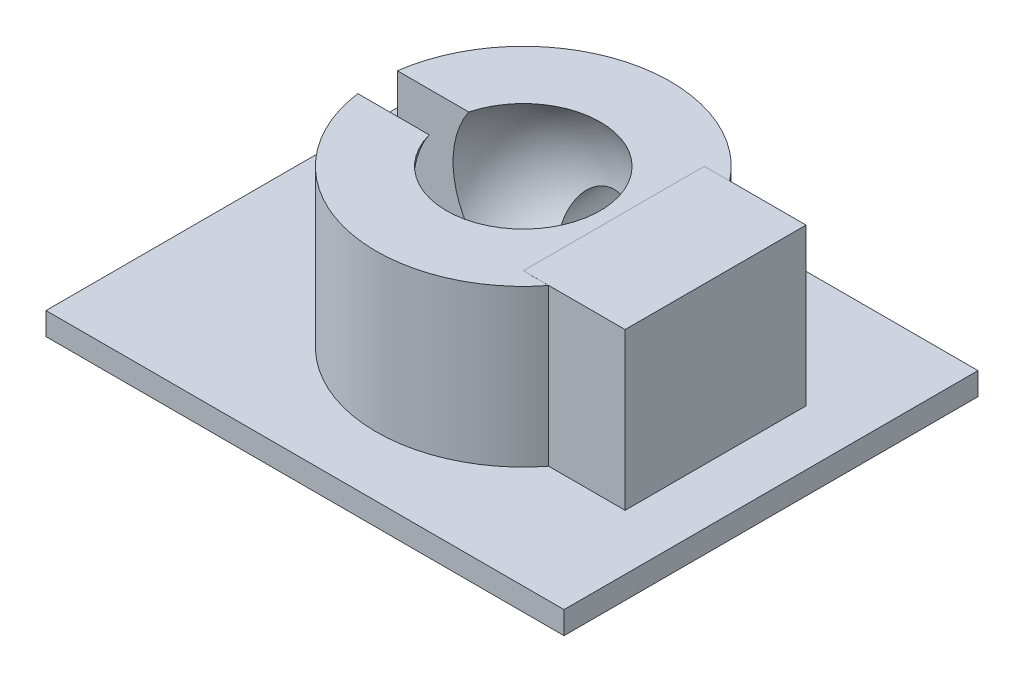
ISO-10303-21;
HEADER;
FILE_DESCRIPTION(('STEP AP214'),'2;1');
FILE_NAME('part.step','',(''),(''),'','','');
FILE_SCHEMA(('AUTOMOTIVE_DESIGN { 1 0 10303 214 1 1 1 1 }'));
ENDSEC;
DATA;
#1=APPLICATION_CONTEXT('core data for automotive mechanical design processes');
#2=APPLICATION_PROTOCOL_DEFINITION('international standard','automotive_design',2000,#1);
#3=PRODUCT_CONTEXT('',#1,'mechanical');
#4=PRODUCT('Part','Part','',(#3));
#5=PRODUCT_RELATED_PRODUCT_CATEGORY('part','',(#4));
#6=PRODUCT_DEFINITION_FORMATION('','',#4);
#7=PRODUCT_DEFINITION_CONTEXT('part definition',#1,'design');
#8=PRODUCT_DEFINITION('design','',#6,#7);
#9=PRODUCT_DEFINITION_SHAPE('','',#8);
#10=(LENGTH_UNIT() NAMED_UNIT(*) SI_UNIT(.MILLI.,.METRE.));
#11=(NAMED_UNIT(*) PLANE_ANGLE_UNIT() SI_UNIT($,.RADIAN.));
#12=(NAMED_UNIT(*) SI_UNIT($,.STERADIAN.) SOLID_ANGLE_UNIT());
#13=UNCERTAINTY_MEASURE_WITH_UNIT(LENGTH_MEASURE(1.E-05),#10,'distance_accuracy_value','');
#14=(GEOMETRIC_REPRESENTATION_CONTEXT(3) GLOBAL_UNCERTAINTY_ASSIGNED_CONTEXT((#13)) GLOBAL_UNIT_ASSIGNED_CONTEXT((#10,
#11,#12)) REPRESENTATION_CONTEXT('',''));
#15=CARTESIAN_POINT('',(0.,0.,0.));
#16=DIRECTION('',(0.,0.,1.));
#17=DIRECTION('',(1.,0.,0.));
#18=AXIS2_PLACEMENT_3D('',#15,#16,#17);
#19=CARTESIAN_POINT('',(0.,15.84,0.));
#20=DIRECTION('',(0.,-1.,0.));
#21=DIRECTION('',(0.,0.,-1.));
#22=AXIS2_PLACEMENT_3D('',#19,#20,#21);
#23=CYLINDRICAL_SURFACE('',#22,13.);
#24=CARTESIAN_POINT('',(2.85,7.2,-12.6837494456489));
#25=CARTESIAN_POINT('',(2.84999457814601,7.04199211718748,-12.683752639175));
#26=CARTESIAN_POINT('',(2.83681505009,6.88391914794053,-12.6867341814607));
#27=CARTESIAN_POINT('',(2.78450326327586,6.57226918502549,-12.6983161510032));
#28=CARTESIAN_POINT('',(2.74535229710446,6.41869551555586,-12.7069206284339));
#29=CARTESIAN_POINT('',(2.64239018842769,6.12059737544053,-12.7287281927453));
#30=CARTESIAN_POINT('',(2.57860617578493,5.97606315188572,-12.741926218899));
#31=CARTESIAN_POINT('',(2.42826627805288,5.6997437142269,-12.7714277008736));
#32=CARTESIAN_POINT('',(2.34171083999033,5.56795824992097,-12.787731095731));
#33=CARTESIAN_POINT('',(2.14671933312393,5.31863880501277,-12.8219154465526));
#34=CARTESIAN_POINT('',(2.03796985040492,5.20135267861249,-12.8398166611201));
#35=CARTESIAN_POINT('',(1.80235380097448,4.98653214572527,-12.875002301063));
#36=CARTESIAN_POINT('',(1.67548582327419,4.88899927896728,-12.8922866782708));
#37=CARTESIAN_POINT('',(1.40557181065307,4.71547295236465,-12.9245118312371));
#38=CARTESIAN_POINT('',(1.26236900777135,4.63971795634621,-12.939425916034));
#39=CARTESIAN_POINT('',(0.964883943547343,4.51344068026091,-12.9650012018085));
#40=CARTESIAN_POINT('',(0.810602933542202,4.46291555547005,-12.9756628822269));
#41=CARTESIAN_POINT('',(0.497918114659505,4.38931199385956,-12.991388916655));
#42=CARTESIAN_POINT('',(0.339617423197319,4.36581405843454,-12.9965387322379));
#43=CARTESIAN_POINT('',(0.0212426812353905,4.34562021843313,-13.0009569161528));
#44=CARTESIAN_POINT('',(-0.138831163380759,4.34892123409904,-13.0002259603081));
#45=CARTESIAN_POINT('',(-0.453316132225556,4.38191932163188,-12.9930302485539));
#46=CARTESIAN_POINT('',(-0.607777280632989,4.41116421641512,-12.9866637194479));
#47=CARTESIAN_POINT('',(-0.909544735417951,4.49449925403317,-12.9690241717223));
#48=CARTESIAN_POINT('',(-1.05685071697575,4.54859052364369,-12.9577509305859));
#49=CARTESIAN_POINT('',(-1.3413806317717,4.68048231020951,-12.9314067961729));
#50=CARTESIAN_POINT('',(-1.47852255749359,4.75845406811767,-12.9163086149913));
#51=CARTESIAN_POINT('',(-1.73794026407782,4.93576577133281,-12.8839698123818));
#52=CARTESIAN_POINT('',(-1.86021400743718,5.03510864013599,-12.8667288979714));
#53=CARTESIAN_POINT('',(-2.08911385803712,5.25480376479951,-12.831574861524));
#54=CARTESIAN_POINT('',(-2.19535947469234,5.37555175910412,-12.8136552214554));
#55=CARTESIAN_POINT('',(-2.38616440780198,5.63333648895701,-12.7795008740164));
#56=CARTESIAN_POINT('',(-2.47072313092283,5.77037367001248,-12.7632662127526));
#57=CARTESIAN_POINT('',(-2.61592418938986,6.05746396395508,-12.7343026762405));
#58=CARTESIAN_POINT('',(-2.67649431629764,6.20755474062339,-12.7215844199456));
#59=CARTESIAN_POINT('',(-2.77143785655332,6.51612934551443,-12.7012406610616));
#60=CARTESIAN_POINT('',(-2.80581544671902,6.67461183123261,-12.6936143465052));
#61=CARTESIAN_POINT('',(-2.84680724633995,6.99199362570388,-12.6844836257708));
#62=CARTESIAN_POINT('',(-2.85397561097445,7.15081793075217,-12.6828570459931));
#63=CARTESIAN_POINT('',(-2.84184604413616,7.46739222853821,-12.6855803470866));
#64=CARTESIAN_POINT('',(-2.82254993988463,7.62514229469034,-12.6899298153456));
#65=CARTESIAN_POINT('',(-2.75852005661616,7.93315865363888,-12.7039997410091));
#66=CARTESIAN_POINT('',(-2.7140917645201,8.08349167098519,-12.7136556579756));
#67=CARTESIAN_POINT('',(-2.60138955360095,8.37457984329172,-12.7371922332786));
#68=CARTESIAN_POINT('',(-2.53311334368186,8.51533407645454,-12.7510732975132));
#69=CARTESIAN_POINT('',(-2.37343343419326,8.78566653369884,-12.7817643730783));
#70=CARTESIAN_POINT('',(-2.28168851880467,8.91503834687656,-12.798616346249));
#71=CARTESIAN_POINT('',(-2.07812174800801,9.15675337363935,-12.8332398963129));
#72=CARTESIAN_POINT('',(-1.96629738727772,9.26909445906268,-12.8510115877626));
#73=CARTESIAN_POINT('',(-1.72323782951113,9.47571145768575,-12.8858750533308));
#74=CARTESIAN_POINT('',(-1.59167821427601,9.5696094785427,-12.9029478507508));
#75=CARTESIAN_POINT('',(-1.31433100395662,9.73397190897161,-12.9341400353273));
#76=CARTESIAN_POINT('',(-1.16854407537848,9.80443741560427,-12.9482595607384));
#77=CARTESIAN_POINT('',(-0.867790948180158,9.91940901401435,-12.9718743296362));
#78=CARTESIAN_POINT('',(-0.712890181138144,9.96407997520845,-12.9813988766561));
#79=CARTESIAN_POINT('',(-0.397550404994966,10.0267090305703,-12.994877255881));
#80=CARTESIAN_POINT('',(-0.237112208417187,10.0446710269161,-12.9988319018438));
#81=CARTESIAN_POINT('',(0.0811613433687345,10.0531961539511,-13.000700597871));
#82=CARTESIAN_POINT('',(0.238981122228655,10.0443233905905,-12.9987390180743));
#83=CARTESIAN_POINT('',(0.550821825446172,10.0006931110576,-12.9892622768432));
#84=CARTESIAN_POINT('',(0.704842818651223,9.96593606435678,-12.9817472161341));
#85=CARTESIAN_POINT('',(1.00427520561563,9.87179469459657,-12.9620172693561));
#86=CARTESIAN_POINT('',(1.1497129352056,9.81249071681113,-12.9498177255386));
#87=CARTESIAN_POINT('',(1.4286485814395,9.67101711644236,-12.9220212485419));
#88=CARTESIAN_POINT('',(1.56214533166847,9.58884526330262,-12.9064239839776));
#89=CARTESIAN_POINT('',(1.81615997073245,9.40213090011084,-12.8731621246939));
#90=CARTESIAN_POINT('',(1.93638203275955,9.29719190757184,-12.8554637967618));
#91=CARTESIAN_POINT('',(2.15770295120599,9.06872137256736,-12.8201757894123));
#92=CARTESIAN_POINT('',(2.25879718824908,8.94518535181458,-12.8025861372298));
#93=CARTESIAN_POINT('',(2.44030274899356,8.68102983280113,-12.7692433230865));
#94=CARTESIAN_POINT('',(2.52041768495175,8.54020296010177,-12.7535180354791));
#95=CARTESIAN_POINT('',(2.65571630709806,8.24676938102076,-12.7260352735789));
#96=CARTESIAN_POINT('',(2.71092104940724,8.09417275165109,-12.7142744503338));
#97=CARTESIAN_POINT('',(2.78500100109206,7.81785560525803,-12.6982215600804));
#98=CARTESIAN_POINT('',(2.8093287860261,7.69563150626974,-12.6928306080988));
#99=CARTESIAN_POINT('',(2.84183002421795,7.44895166676108,-12.6855933799393));
#100=CARTESIAN_POINT('',(2.85000427193453,7.32449603629506,-12.6837469294369));
#101=CARTESIAN_POINT('',(2.85,7.2,-12.6837494456489));
#102=B_SPLINE_CURVE_WITH_KNOTS('',3,(#24,#25,#26,#27,#28,#29,#30,#31,#32,#33,#34,#35,#36,#37,
#38,#39,#40,#41,#42,#43,#44,#45,#46,#47,#48,#49,#50,#51,#52,#53,#54,#55,#56,#57,#58,#59,#60,#61,
#62,#63,#64,#65,#66,#67,#68,#69,#70,#71,#72,#73,#74,#75,#76,#77,#78,#79,#80,#81,#82,#83,#84,#85,
#86,#87,#88,#89,#90,#91,#92,#93,#94,#95,#96,#97,#98,#99,#100,#101),.UNSPECIFIED.,.T.,.F.,(4,2,2,
2,2,2,2,2,2,2,2,2,2,2,2,2,2,2,2,2,2,2,2,2,2,2,2,2,2,2,2,2,2,2,2,2,2,2,4),(0.,0.47356736558192,
0.947476216068068,1.42086460378329,1.89424369908617,2.37483847588496,2.85547069972483,
3.34118107690835,3.82683667679583,4.30484795958542,4.78280430969933,5.2525905041419,
5.72239800535252,6.1956565440954,6.66897986423184,7.15219665860458,7.63542667193723,
8.12010040478494,8.60469683248835,9.07936909035866,9.55400857645529,10.0229990082994,
10.4920345089746,10.9683209332694,11.4446668253998,11.9299372630078,12.4151849780821,
12.897295818679,13.379336215989,13.8513143483056,14.3232839204113,14.7937207402394,
15.2642034630583,15.7436523504286,16.2232168774919,16.7092297924385,17.1948311166262,
17.567978068022,17.9411066669515),.UNSPECIFIED.);
#103=CARTESIAN_POINT('',(2.85,7.2,-12.6837494456489));
#104=VERTEX_POINT('',#103);
#105=EDGE_CURVE('E194',#104,#104,#102,.T.);
#106=ORIENTED_EDGE('',*,*,#105,.F.);
#107=EDGE_LOOP('',(#106));
#108=FACE_BOUND('',#107,.T.);
#109=DIRECTION('',(0.,-1.,0.));
#110=VECTOR('',#109,1.);
#111=CARTESIAN_POINT('',(-12.8816730279883,15.84,-1.75));
#112=LINE('',#111,#110);
#113=CARTESIAN_POINT('',(-12.8816730279883,15.84,-1.75));
#114=VERTEX_POINT('',#113);
#115=CARTESIAN_POINT('',(-12.8816730279883,2.,-1.75));
#116=VERTEX_POINT('',#115);
#117=EDGE_CURVE('E154',#114,#116,#112,.T.);
#118=ORIENTED_EDGE('',*,*,#117,.F.);
#119=CARTESIAN_POINT('',(0.,15.84,0.));
#120=DIRECTION('',(0.,1.,0.));
#121=DIRECTION('',(0.,0.,1.));
#122=AXIS2_PLACEMENT_3D('',#119,#120,#121);
#123=CIRCLE('',#122,13.);
#124=CARTESIAN_POINT('',(10.2469507659596,15.84,-8.));
#125=VERTEX_POINT('',#124);
#126=EDGE_CURVE('E240',#125,#114,#123,.T.);
#127=ORIENTED_EDGE('',*,*,#126,.F.);
#128=DIRECTION('',(0.,-1.,0.));
#129=VECTOR('',#128,1.);
#130=CARTESIAN_POINT('',(10.2469507659596,15.84,-8.));
#131=LINE('',#130,#129);
#132=CARTESIAN_POINT('',(10.2469507659596,2.,-8.));
#133=VERTEX_POINT('',#132);
#134=EDGE_CURVE('E241',#133,#125,#131,.F.);
#135=ORIENTED_EDGE('',*,*,#134,.F.);
#136=CARTESIAN_POINT('',(0.,2.,0.));
#137=DIRECTION('',(0.,1.,0.));
#138=DIRECTION('',(0.,0.,1.));
#139=AXIS2_PLACEMENT_3D('',#136,#137,#138);
#140=CIRCLE('',#139,13.);
#141=EDGE_CURVE('E248',#133,#116,#140,.T.);
#142=ORIENTED_EDGE('',*,*,#141,.T.);
#143=EDGE_LOOP('',(#118,#127,#135,#142));
#144=FACE_BOUND('',#143,.T.);
#145=ADVANCED_FACE('F43',(#108,#144),#23,.T.);
#146=CARTESIAN_POINT('',(0.,2.,0.));
#147=DIRECTION('',(0.,1.,0.));
#148=DIRECTION('',(0.,0.,1.));
#149=AXIS2_PLACEMENT_3D('',#146,#147,#148);
#150=PLANE('',#149);
#151=CARTESIAN_POINT('',(-12.8816730279883,2.,1.75));
#152=VERTEX_POINT('',#151);
#153=CARTESIAN_POINT('',(10.2469507659596,2.,8.));
#154=VERTEX_POINT('',#153);
#155=EDGE_CURVE('E251',#152,#154,#140,.T.);
#156=ORIENTED_EDGE('',*,*,#155,.F.);
#157=DIRECTION('',(1.,0.,0.));
#158=VECTOR('',#157,1.);
#159=CARTESIAN_POINT('',(-13.,2.,1.75));
#160=LINE('',#159,#158);
#161=CARTESIAN_POINT('',(-5.5,2.,1.75));
#162=VERTEX_POINT('',#161);
#163=EDGE_CURVE('E164',#152,#162,#160,.T.);
#164=ORIENTED_EDGE('',*,*,#163,.T.);
#165=DIRECTION('',(0.,0.,-1.));
#166=VECTOR('',#165,1.);
#167=CARTESIAN_POINT('',(-5.5,2.,1.75));
#168=LINE('',#167,#166);
#169=CARTESIAN_POINT('',(-5.5,2.,-1.75));
#170=VERTEX_POINT('',#169);
#171=EDGE_CURVE('E160',#162,#170,#168,.T.);
#172=ORIENTED_EDGE('',*,*,#171,.T.);
#173=DIRECTION('',(1.,0.,0.));
#174=VECTOR('',#173,1.);
#175=CARTESIAN_POINT('',(-13.,2.,-1.75));
#176=LINE('',#175,#174);
#177=EDGE_CURVE('E150',#116,#170,#176,.T.);
#178=ORIENTED_EDGE('',*,*,#177,.F.);
#179=ORIENTED_EDGE('',*,*,#141,.F.);
#180=DIRECTION('',(-1.,0.,0.));
#181=VECTOR('',#180,1.);
#182=CARTESIAN_POINT('',(8.,2.,-8.));
#183=LINE('',#182,#181);
#184=CARTESIAN_POINT('',(17.,2.,-8.));
#185=VERTEX_POINT('',#184);
#186=EDGE_CURVE('E336',#185,#133,#183,.T.);
#187=ORIENTED_EDGE('',*,*,#186,.F.);
#188=DIRECTION('',(0.,0.,-1.));
#189=VECTOR('',#188,1.);
#190=CARTESIAN_POINT('',(17.,2.,-8.));
#191=LINE('',#190,#189);
#192=CARTESIAN_POINT('',(17.,2.,8.));
#193=VERTEX_POINT('',#192);
#194=EDGE_CURVE('E292',#193,#185,#191,.T.);
#195=ORIENTED_EDGE('',*,*,#194,.F.);
#196=DIRECTION('',(1.,0.,0.));
#197=VECTOR('',#196,1.);
#198=CARTESIAN_POINT('',(8.,2.,8.));
#199=LINE('',#198,#197);
#200=EDGE_CURVE('E339',#154,#193,#199,.T.);
#201=ORIENTED_EDGE('',*,*,#200,.F.);
#202=EDGE_LOOP('',(#156,#164,#172,#178,#179,#187,#195,#201));
#203=FACE_BOUND('',#202,.T.);
#204=DIRECTION('',(0.,0.,1.));
#205=VECTOR('',#204,1.);
#206=CARTESIAN_POINT('',(-23.9,2.,-18.3));
#207=LINE('',#206,#205);
#208=CARTESIAN_POINT('',(-23.9,2.,-18.3));
#209=VERTEX_POINT('',#208);
#210=CARTESIAN_POINT('',(-23.9,2.,18.3));
#211=VERTEX_POINT('',#210);
#212=EDGE_CURVE('E252',#209,#211,#207,.T.);
#213=ORIENTED_EDGE('',*,*,#212,.T.);
#214=DIRECTION('',(1.,0.,0.));
#215=VECTOR('',#214,1.);
#216=CARTESIAN_POINT('',(-23.9,2.,18.3));
#217=LINE('',#216,#215);
#218=CARTESIAN_POINT('',(21.9,2.,18.3));
#219=VERTEX_POINT('',#218);
#220=EDGE_CURVE('E255',#211,#219,#217,.T.);
#221=ORIENTED_EDGE('',*,*,#220,.T.);
#222=DIRECTION('',(0.,0.,-1.));
#223=VECTOR('',#222,1.);
#224=CARTESIAN_POINT('',(21.9,2.,-18.3));
#225=LINE('',#224,#223);
#226=CARTESIAN_POINT('',(21.9,2.,-18.3));
#227=VERTEX_POINT('',#226);
#228=EDGE_CURVE('E258',#219,#227,#225,.T.);
#229=ORIENTED_EDGE('',*,*,#228,.T.);
#230=DIRECTION('',(-1.,0.,0.));
#231=VECTOR('',#230,1.);
#232=CARTESIAN_POINT('',(-23.9,2.,-18.3));
#233=LINE('',#232,#231);
#234=EDGE_CURVE('E260',#227,#209,#233,.T.);
#235=ORIENTED_EDGE('',*,*,#234,.T.);
#236=EDGE_LOOP('',(#213,#221,#229,#235));
#237=FACE_BOUND('',#236,.T.);
#238=ADVANCED_FACE('F162',(#203,#237),#150,.T.);
#239=CARTESIAN_POINT('',(-12.8816730279883,15.84,1.75));
#240=VERTEX_POINT('',#239);
#241=CARTESIAN_POINT('',(10.2469507659596,15.84,8.));
#242=VERTEX_POINT('',#241);
#243=EDGE_CURVE('E236',#240,#242,#123,.T.);
#244=ORIENTED_EDGE('',*,*,#243,.F.);
#245=DIRECTION('',(0.,-1.,0.));
#246=VECTOR('',#245,1.);
#247=CARTESIAN_POINT('',(-12.8816730279883,15.84,1.75));
#248=LINE('',#247,#246);
#249=EDGE_CURVE('E183',#240,#152,#248,.T.);
#250=ORIENTED_EDGE('',*,*,#249,.T.);
#251=ORIENTED_EDGE('',*,*,#155,.T.);
#252=DIRECTION('',(0.,-1.,0.));
#253=VECTOR('',#252,1.);
#254=CARTESIAN_POINT('',(10.2469507659596,15.84,8.));
#255=LINE('',#254,#253);
#256=EDGE_CURVE('E238',#242,#154,#255,.T.);
#257=ORIENTED_EDGE('',*,*,#256,.F.);
#258=EDGE_LOOP('',(#244,#250,#251,#257));
#259=FACE_BOUND('',#258,.T.);
#260=ADVANCED_FACE('F218',(#259),#23,.T.);
#261=CARTESIAN_POINT('',(0.,15.84,0.));
#262=DIRECTION('',(0.,1.,0.));
#263=DIRECTION('',(0.,0.,1.));
#264=AXIS2_PLACEMENT_3D('',#261,#262,#263);
#265=PLANE('',#264);
#266=DIRECTION('',(-1.,0.,0.));
#267=VECTOR('',#266,1.);
#268=CARTESIAN_POINT('',(-13.,15.84,1.75));
#269=LINE('',#268,#267);
#270=CARTESIAN_POINT('',(-6.57266308279985,15.84,1.75));
#271=VERTEX_POINT('',#270);
#272=EDGE_CURVE('E168',#271,#240,#269,.T.);
#273=ORIENTED_EDGE('',*,*,#272,.T.);
#274=ORIENTED_EDGE('',*,*,#243,.T.);
#275=DIRECTION('',(-1.,0.,0.));
#276=VECTOR('',#275,1.);
#277=CARTESIAN_POINT('',(0.,15.84,8.));
#278=LINE('',#277,#276);
#279=CARTESIAN_POINT('',(8.,15.84,8.));
#280=VERTEX_POINT('',#279);
#281=EDGE_CURVE('E250',#242,#280,#278,.T.);
#282=ORIENTED_EDGE('',*,*,#281,.T.);
#283=DIRECTION('',(0.,0.,-1.));
#284=VECTOR('',#283,1.);
#285=CARTESIAN_POINT('',(8.,15.84,0.));
#286=LINE('',#285,#284);
#287=CARTESIAN_POINT('',(8.,15.84,-8.));
#288=VERTEX_POINT('',#287);
#289=EDGE_CURVE('E282',#280,#288,#286,.T.);
#290=ORIENTED_EDGE('',*,*,#289,.T.);
#291=DIRECTION('',(1.,0.,0.));
#292=VECTOR('',#291,1.);
#293=CARTESIAN_POINT('',(0.,15.84,-8.));
#294=LINE('',#293,#292);
#295=EDGE_CURVE('E285',#288,#125,#294,.T.);
#296=ORIENTED_EDGE('',*,*,#295,.T.);
#297=ORIENTED_EDGE('',*,*,#126,.T.);
#298=DIRECTION('',(-1.,0.,0.));
#299=VECTOR('',#298,1.);
#300=CARTESIAN_POINT('',(-13.,15.84,-1.75));
#301=LINE('',#300,#299);
#302=CARTESIAN_POINT('',(-6.57266308279985,15.84,-1.75));
#303=VERTEX_POINT('',#302);
#304=EDGE_CURVE('E173',#303,#114,#301,.T.);
#305=ORIENTED_EDGE('',*,*,#304,.F.);
#306=CARTESIAN_POINT('',(0.,15.84,0.));
#307=DIRECTION('',(0.,1.,0.));
#308=DIRECTION('',(0.,0.,1.));
#309=AXIS2_PLACEMENT_3D('',#306,#307,#308);
#310=CIRCLE('',#309,6.80164685940104);
#311=EDGE_CURVE('E289',#271,#303,#310,.T.);
#312=ORIENTED_EDGE('',*,*,#311,.F.);
#313=EDGE_LOOP('',(#273,#274,#282,#290,#296,#297,#305,#312));
#314=FACE_BOUND('',#313,.T.);
#315=ADVANCED_FACE('F228',(#314),#265,.T.);
#316=CARTESIAN_POINT('',(-23.9,2.,-18.3));
#317=DIRECTION('',(1.,0.,0.));
#318=DIRECTION('',(0.,0.,-1.));
#319=AXIS2_PLACEMENT_3D('',#316,#317,#318);
#320=PLANE('',#319);
#321=DIRECTION('',(0.,0.,1.));
#322=VECTOR('',#321,1.);
#323=CARTESIAN_POINT('',(-23.9,0.,-18.3));
#324=LINE('',#323,#322);
#325=CARTESIAN_POINT('',(-23.9,0.,-18.3));
#326=VERTEX_POINT('',#325);
#327=CARTESIAN_POINT('',(-23.9,0.,18.3));
#328=VERTEX_POINT('',#327);
#329=EDGE_CURVE('E244',#326,#328,#324,.T.);
#330=ORIENTED_EDGE('',*,*,#329,.T.);
#331=DIRECTION('',(0.,-1.,0.));
#332=VECTOR('',#331,1.);
#333=CARTESIAN_POINT('',(-23.9,2.,18.3));
#334=LINE('',#333,#332);
#335=EDGE_CURVE('E278',#211,#328,#334,.T.);
#336=ORIENTED_EDGE('',*,*,#335,.F.);
#337=ORIENTED_EDGE('',*,*,#212,.F.);
#338=DIRECTION('',(0.,-1.,0.));
#339=VECTOR('',#338,1.);
#340=CARTESIAN_POINT('',(-23.9,2.,-18.3));
#341=LINE('',#340,#339);
#342=EDGE_CURVE('E262',#209,#326,#341,.T.);
#343=ORIENTED_EDGE('',*,*,#342,.T.);
#344=EDGE_LOOP('',(#330,#336,#337,#343));
#345=FACE_BOUND('',#344,.T.);
#346=ADVANCED_FACE('F45',(#345),#320,.F.);
#347=CARTESIAN_POINT('',(-23.9,2.,18.3));
#348=DIRECTION('',(0.,0.,-1.));
#349=DIRECTION('',(-1.,0.,0.));
#350=AXIS2_PLACEMENT_3D('',#347,#348,#349);
#351=PLANE('',#350);
#352=DIRECTION('',(1.,0.,0.));
#353=VECTOR('',#352,1.);
#354=CARTESIAN_POINT('',(-23.9,0.,18.3));
#355=LINE('',#354,#353);
#356=CARTESIAN_POINT('',(21.9,0.,18.3));
#357=VERTEX_POINT('',#356);
#358=EDGE_CURVE('E265',#328,#357,#355,.T.);
#359=ORIENTED_EDGE('',*,*,#358,.T.);
#360=DIRECTION('',(0.,-1.,0.));
#361=VECTOR('',#360,1.);
#362=CARTESIAN_POINT('',(21.9,2.,18.3));
#363=LINE('',#362,#361);
#364=EDGE_CURVE('E275',#219,#357,#363,.T.);
#365=ORIENTED_EDGE('',*,*,#364,.F.);
#366=ORIENTED_EDGE('',*,*,#220,.F.);
#367=ORIENTED_EDGE('',*,*,#335,.T.);
#368=EDGE_LOOP('',(#359,#365,#366,#367));
#369=FACE_BOUND('',#368,.T.);
#370=ADVANCED_FACE('F451',(#369),#351,.F.);
#371=CARTESIAN_POINT('',(21.9,2.,-18.3));
#372=DIRECTION('',(-1.,0.,0.));
#373=DIRECTION('',(0.,0.,1.));
#374=AXIS2_PLACEMENT_3D('',#371,#372,#373);
#375=PLANE('',#374);
#376=DIRECTION('',(0.,0.,-1.));
#377=VECTOR('',#376,1.);
#378=CARTESIAN_POINT('',(21.9,0.,-18.3));
#379=LINE('',#378,#377);
#380=CARTESIAN_POINT('',(21.9,0.,-18.3));
#381=VERTEX_POINT('',#380);
#382=EDGE_CURVE('E267',#357,#381,#379,.T.);
#383=ORIENTED_EDGE('',*,*,#382,.T.);
#384=DIRECTION('',(0.,-1.,0.));
#385=VECTOR('',#384,1.);
#386=CARTESIAN_POINT('',(21.9,2.,-18.3));
#387=LINE('',#386,#385);
#388=EDGE_CURVE('E272',#227,#381,#387,.T.);
#389=ORIENTED_EDGE('',*,*,#388,.F.);
#390=ORIENTED_EDGE('',*,*,#228,.F.);
#391=ORIENTED_EDGE('',*,*,#364,.T.);
#392=EDGE_LOOP('',(#383,#389,#390,#391));
#393=FACE_BOUND('',#392,.T.);
#394=ADVANCED_FACE('F442',(#393),#375,.F.);
#395=CARTESIAN_POINT('',(-23.9,2.,-18.3));
#396=DIRECTION('',(0.,0.,1.));
#397=DIRECTION('',(1.,0.,0.));
#398=AXIS2_PLACEMENT_3D('',#395,#396,#397);
#399=PLANE('',#398);
#400=DIRECTION('',(-1.,0.,0.));
#401=VECTOR('',#400,1.);
#402=CARTESIAN_POINT('',(-23.9,0.,-18.3));
#403=LINE('',#402,#401);
#404=EDGE_CURVE('E256',#381,#326,#403,.T.);
#405=ORIENTED_EDGE('',*,*,#404,.T.);
#406=ORIENTED_EDGE('',*,*,#342,.F.);
#407=ORIENTED_EDGE('',*,*,#234,.F.);
#408=ORIENTED_EDGE('',*,*,#388,.T.);
#409=EDGE_LOOP('',(#405,#406,#407,#408));
#410=FACE_BOUND('',#409,.T.);
#411=ADVANCED_FACE('F432',(#410),#399,.F.);
#412=CARTESIAN_POINT('',(0.,0.,0.));
#413=DIRECTION('',(0.,1.,0.));
#414=DIRECTION('',(0.,0.,1.));
#415=AXIS2_PLACEMENT_3D('',#412,#413,#414);
#416=PLANE('',#415);
#417=ORIENTED_EDGE('',*,*,#329,.F.);
#418=ORIENTED_EDGE('',*,*,#404,.F.);
#419=ORIENTED_EDGE('',*,*,#382,.F.);
#420=ORIENTED_EDGE('',*,*,#358,.F.);
#421=EDGE_LOOP('',(#417,#418,#419,#420));
#422=FACE_BOUND('',#421,.T.);
#423=ADVANCED_FACE('F320',(#422),#416,.F.);
#424=CARTESIAN_POINT('',(8.,15.8424937395616,-8.));
#425=DIRECTION('',(0.,0.,1.));
#426=DIRECTION('',(1.,0.,0.));
#427=AXIS2_PLACEMENT_3D('',#424,#425,#426);
#428=PLANE('',#427);
#429=ORIENTED_EDGE('',*,*,#186,.T.);
#430=ORIENTED_EDGE('',*,*,#134,.T.);
#431=ORIENTED_EDGE('',*,*,#295,.F.);
#432=DIRECTION('',(0.,-1.,0.));
#433=VECTOR('',#432,1.);
#434=CARTESIAN_POINT('',(8.,15.8424937395616,-8.));
#435=LINE('',#434,#433);
#436=CARTESIAN_POINT('',(8.,15.8424937395616,-8.));
#437=VERTEX_POINT('',#436);
#438=EDGE_CURVE('E348',#437,#288,#435,.T.);
#439=ORIENTED_EDGE('',*,*,#438,.F.);
#440=DIRECTION('',(-1.,0.,0.));
#441=VECTOR('',#440,1.);
#442=CARTESIAN_POINT('',(8.,15.8424937395616,-8.));
#443=LINE('',#442,#441);
#444=CARTESIAN_POINT('',(17.,15.8424937395616,-8.));
#445=VERTEX_POINT('',#444);
#446=EDGE_CURVE('E354',#445,#437,#443,.T.);
#447=ORIENTED_EDGE('',*,*,#446,.F.);
#448=DIRECTION('',(0.,-1.,0.));
#449=VECTOR('',#448,1.);
#450=CARTESIAN_POINT('',(17.,15.8424937395616,-8.));
#451=LINE('',#450,#449);
#452=EDGE_CURVE('E332',#445,#185,#451,.T.);
#453=ORIENTED_EDGE('',*,*,#452,.T.);
#454=EDGE_LOOP('',(#429,#430,#431,#439,#447,#453));
#455=FACE_BOUND('',#454,.T.);
#456=ADVANCED_FACE('F314',(#455),#428,.F.);
#457=CARTESIAN_POINT('',(8.,15.8424937395616,8.));
#458=DIRECTION('',(0.,0.,-1.));
#459=DIRECTION('',(-1.,0.,0.));
#460=AXIS2_PLACEMENT_3D('',#457,#458,#459);
#461=PLANE('',#460);
#462=ORIENTED_EDGE('',*,*,#281,.F.);
#463=ORIENTED_EDGE('',*,*,#256,.T.);
#464=ORIENTED_EDGE('',*,*,#200,.T.);
#465=DIRECTION('',(0.,-1.,0.));
#466=VECTOR('',#465,1.);
#467=CARTESIAN_POINT('',(17.,15.8424937395616,8.));
#468=LINE('',#467,#466);
#469=CARTESIAN_POINT('',(17.,15.8424937395616,8.));
#470=VERTEX_POINT('',#469);
#471=EDGE_CURVE('E334',#470,#193,#468,.T.);
#472=ORIENTED_EDGE('',*,*,#471,.F.);
#473=DIRECTION('',(1.,0.,0.));
#474=VECTOR('',#473,1.);
#475=CARTESIAN_POINT('',(8.,15.8424937395616,8.));
#476=LINE('',#475,#474);
#477=CARTESIAN_POINT('',(8.,15.8424937395616,8.));
#478=VERTEX_POINT('',#477);
#479=EDGE_CURVE('E346',#478,#470,#476,.T.);
#480=ORIENTED_EDGE('',*,*,#479,.F.);
#481=DIRECTION('',(0.,-1.,0.));
#482=VECTOR('',#481,1.);
#483=CARTESIAN_POINT('',(8.,15.8424937395616,8.));
#484=LINE('',#483,#482);
#485=EDGE_CURVE('E66',#478,#280,#484,.T.);
#486=ORIENTED_EDGE('',*,*,#485,.T.);
#487=EDGE_LOOP('',(#462,#463,#464,#472,#480,#486));
#488=FACE_BOUND('',#487,.T.);
#489=ADVANCED_FACE('F310',(#488),#461,.F.);
#490=CARTESIAN_POINT('',(17.,15.8424937395616,-8.));
#491=DIRECTION('',(-1.,0.,0.));
#492=DIRECTION('',(0.,0.,1.));
#493=AXIS2_PLACEMENT_3D('',#490,#491,#492);
#494=PLANE('',#493);
#495=ORIENTED_EDGE('',*,*,#194,.T.);
#496=ORIENTED_EDGE('',*,*,#452,.F.);
#497=DIRECTION('',(0.,0.,-1.));
#498=VECTOR('',#497,1.);
#499=CARTESIAN_POINT('',(17.,15.8424937395616,-8.));
#500=LINE('',#499,#498);
#501=EDGE_CURVE('E341',#470,#445,#500,.T.);
#502=ORIENTED_EDGE('',*,*,#501,.F.);
#503=ORIENTED_EDGE('',*,*,#471,.T.);
#504=EDGE_LOOP('',(#495,#496,#502,#503));
#505=FACE_BOUND('',#504,.T.);
#506=ADVANCED_FACE('F313',(#505),#494,.F.);
#507=CARTESIAN_POINT('',(8.,15.8424937395616,-8.));
#508=DIRECTION('',(1.,0.,0.));
#509=DIRECTION('',(0.,0.,-1.));
#510=AXIS2_PLACEMENT_3D('',#507,#508,#509);
#511=PLANE('',#510);
#512=ORIENTED_EDGE('',*,*,#289,.F.);
#513=ORIENTED_EDGE('',*,*,#485,.F.);
#514=DIRECTION('',(0.,0.,1.));
#515=VECTOR('',#514,1.);
#516=CARTESIAN_POINT('',(8.,15.8424937395616,-8.));
#517=LINE('',#516,#515);
#518=EDGE_CURVE('E353',#437,#478,#517,.T.);
#519=ORIENTED_EDGE('',*,*,#518,.F.);
#520=ORIENTED_EDGE('',*,*,#438,.T.);
#521=EDGE_LOOP('',(#512,#513,#519,#520));
#522=FACE_BOUND('',#521,.T.);
#523=ADVANCED_FACE('F305',(#522),#511,.F.);
#524=CARTESIAN_POINT('',(0.,15.8424937395616,0.));
#525=DIRECTION('',(0.,1.,0.));
#526=DIRECTION('',(0.,0.,1.));
#527=AXIS2_PLACEMENT_3D('',#524,#525,#526);
#528=PLANE('',#527);
#529=ORIENTED_EDGE('',*,*,#501,.T.);
#530=ORIENTED_EDGE('',*,*,#446,.T.);
#531=ORIENTED_EDGE('',*,*,#518,.T.);
#532=ORIENTED_EDGE('',*,*,#479,.T.);
#533=EDGE_LOOP('',(#529,#530,#531,#532));
#534=FACE_BOUND('',#533,.T.);
#535=ADVANCED_FACE('F299',(#534),#528,.T.);
#536=CARTESIAN_POINT('',(0.,11.35,0.));
#537=DIRECTION('',(0.,-1.,0.));
#538=DIRECTION('',(-1.,0.,0.));
#539=AXIS2_PLACEMENT_3D('',#536,#537,#538);
#540=SPHERICAL_SURFACE('',#539,8.15);
#541=CARTESIAN_POINT('',(-2.46578119390435,5.77086631003686,-5.40515405638969));
#542=CARTESIAN_POINT('',(-2.36412433400683,5.59545368447535,-5.27046584612968));
#543=CARTESIAN_POINT('',(-2.24297003254576,5.42944573829204,-5.13791342388206));
#544=CARTESIAN_POINT('',(-1.96242957547858,5.12287777386784,-4.883991119246));
#545=CARTESIAN_POINT('',(-1.80310090932048,4.98228004189554,-4.76260479787918));
#546=CARTESIAN_POINT('',(-1.51778172701856,4.78423898619344,-4.58597807820697));
#547=CARTESIAN_POINT('',(-1.40367239548105,4.71594429737171,-4.52361088252093));
#548=CARTESIAN_POINT('',(-1.16242870537322,4.59434791153874,-4.41064066866188));
#549=CARTESIAN_POINT('',(-1.03532073679499,4.54101662893746,-4.36001447111827));
#550=CARTESIAN_POINT('',(-0.792456699167119,4.45992815048083,-4.28207595957214));
#551=CARTESIAN_POINT('',(-0.678452644911999,4.42936267398956,-4.25226177605996));
#552=CARTESIAN_POINT('',(-0.444886656871043,4.38242572783257,-4.20620661096595));
#553=CARTESIAN_POINT('',(-0.325329024218057,4.36604346049381,-4.18995530431013));
#554=CARTESIAN_POINT('',(-0.0835040833496918,4.34863723150331,-4.17268181337838));
#555=CARTESIAN_POINT('',(0.0387718985076012,4.34767275935127,-4.17171861831988));
#556=CARTESIAN_POINT('',(0.281575216344912,4.36133631370916,-4.18528746099765));
#557=CARTESIAN_POINT('',(0.402102121762159,4.37596811563971,-4.19982325060379));
#558=CARTESIAN_POINT('',(0.63126456027819,4.41848152803669,-4.24161427605322));
#559=CARTESIAN_POINT('',(0.740188711444536,4.4455817087133,-4.2681178491755));
#560=CARTESIAN_POINT('',(0.951347234438533,4.51119257805224,-4.33144337006489));
#561=CARTESIAN_POINT('',(1.05357810970957,4.54970917347261,-4.36827065870033));
#562=CARTESIAN_POINT('',(1.29577550650029,4.65673658945339,-4.46899874765192));
#563=CARTESIAN_POINT('',(1.43132834470481,4.73088093776622,-4.53754363256815));
#564=CARTESIAN_POINT('',(1.68457315067708,4.89615789788797,-4.68627579580075));
#565=CARTESIAN_POINT('',(1.80222324236347,4.98732926162812,-4.76648953743023));
#566=CARTESIAN_POINT('',(2.049669446335,5.21093455052197,-4.95779468109061));
#567=CARTESIAN_POINT('',(2.17365897295057,5.34777712132683,-5.0712473243018));
#568=CARTESIAN_POINT('',(2.39140289937685,5.63898246539653,-5.30421455388634));
#569=CARTESIAN_POINT('',(2.48514684096645,5.79335127393809,-5.42373122056248));
#570=CARTESIAN_POINT('',(2.64248178162313,6.11718547607492,-5.66612502129942));
#571=CARTESIAN_POINT('',(2.70575435443201,6.28678920882648,-5.78902402948423));
#572=CARTESIAN_POINT('',(2.79936530659519,6.63549041129889,-6.03382849063412));
#573=CARTESIAN_POINT('',(2.82970282647049,6.81458812864854,-6.15573391758815));
#574=CARTESIAN_POINT('',(2.85660786727388,7.19042371241161,-6.40425247798922));
#575=CARTESIAN_POINT('',(2.85071287261088,7.38752829381445,-6.53061388673513));
#576=CARTESIAN_POINT('',(2.81065769292421,7.68226482573108,-6.71446939634277));
#577=CARTESIAN_POINT('',(2.79208040219357,7.78042388167006,-6.77484621139822));
#578=CARTESIAN_POINT('',(2.74429519781909,7.97550577561178,-6.89330773594256));
#579=CARTESIAN_POINT('',(2.715093567776,8.0724293093468,-6.95139377781282));
#580=CARTESIAN_POINT('',(2.64822662266339,8.25755584532349,-7.06102098327827));
#581=CARTESIAN_POINT('',(2.61126178663086,8.34590722840444,-7.11273967074265));
#582=CARTESIAN_POINT('',(2.52790879415417,8.51964052997862,-7.21339354074421));
#583=CARTESIAN_POINT('',(2.48152637927016,8.60502422079766,-7.26233039610765));
#584=CARTESIAN_POINT('',(2.3793874467022,8.77180576807278,-7.35701903783285));
#585=CARTESIAN_POINT('',(2.32363544642155,8.85320552101941,-7.40277234413402));
#586=CARTESIAN_POINT('',(2.20290895131431,9.01095322492085,-7.49068377539734));
#587=CARTESIAN_POINT('',(2.13793621961505,9.08730213758141,-7.532842585214));
#588=CARTESIAN_POINT('',(2.00846549932887,9.223904509443,-7.60770097559899));
#589=CARTESIAN_POINT('',(1.94508520378975,9.28494001556497,-7.64090947140626));
#590=CARTESIAN_POINT('',(1.8120020630059,9.40158483217094,-7.70400214372985));
#591=CARTESIAN_POINT('',(1.74230049025455,9.45719523008875,-7.73388698662341));
#592=CARTESIAN_POINT('',(1.59706443085114,9.56218156107656,-7.79001892434139));
#593=CARTESIAN_POINT('',(1.52153484736268,9.61156264471921,-7.81626902624934));
#594=CARTESIAN_POINT('',(1.36522315291143,9.70337664722795,-7.86486588960855));
#595=CARTESIAN_POINT('',(1.2844418751626,9.74581066454896,-7.88721326818723));
#596=CARTESIAN_POINT('',(1.05833967828125,9.85088750447032,-7.9423606990495));
#597=CARTESIAN_POINT('',(0.908429047876994,9.90608143806962,-7.97110103336365));
#598=CARTESIAN_POINT('',(0.599750443014311,9.9907717180248,-8.0150730674113));
#599=CARTESIAN_POINT('',(0.440988714350224,10.0202859470829,-8.03031416780588));
#600=CARTESIAN_POINT('',(0.134945218391982,10.0505623761207,-8.04594421809243));
#601=CARTESIAN_POINT('',(-0.0120379138208693,10.0537343727449,-8.04757801367398));
#602=CARTESIAN_POINT('',(-0.304386132310572,10.0374760281497,-8.03918961237203));
#603=CARTESIAN_POINT('',(-0.449751573357063,10.0180507453614,-8.02917002411408));
#604=CARTESIAN_POINT('',(-0.731027555313431,9.95830768301633,-7.99822996148299));
#605=CARTESIAN_POINT('',(-0.86708369211371,9.91852512629339,-7.97758867285533));
#606=CARTESIAN_POINT('',(-1.13014734109474,9.82011404505132,-7.92622880256519));
#607=CARTESIAN_POINT('',(-1.25715391375069,9.7614835672156,-7.89550917642086));
#608=CARTESIAN_POINT('',(-1.5040521459049,9.62507541687653,-7.82348827017915));
#609=CARTESIAN_POINT('',(-1.62347076968909,9.54663814868103,-7.78181988877754));
#610=CARTESIAN_POINT('',(-1.84722894942309,9.37489294958157,-7.68968347222359));
#611=CARTESIAN_POINT('',(-1.95156376389135,9.28158036203069,-7.63921268105253));
#612=CARTESIAN_POINT('',(-2.15224563870374,9.07428857074238,-7.52579462605737));
#613=CARTESIAN_POINT('',(-2.24705062974469,8.95920844915762,-7.46213611622001));
#614=CARTESIAN_POINT('',(-2.41603069737721,8.71885081777762,-7.32724466342764));
#615=CARTESIAN_POINT('',(-2.49019791423522,8.59356944633207,-7.25600884895325));
#616=CARTESIAN_POINT('',(-2.62531445002784,8.32075558337892,-7.09835888923082));
#617=CARTESIAN_POINT('',(-2.68359347304276,8.17236110527437,-7.01115015618971));
#618=CARTESIAN_POINT('',(-2.77425418953106,7.87138429438903,-6.83067680594016));
#619=CARTESIAN_POINT('',(-2.80661735511236,7.71879904598494,-6.7374079075795));
#620=CARTESIAN_POINT('',(-2.84875028092687,7.39338929746708,-6.53408315575051));
#621=CARTESIAN_POINT('',(-2.85505842744953,7.22049837492107,-6.42341588021303));
#622=CARTESIAN_POINT('',(-2.83700232654464,6.87876190398009,-6.19869648788024));
#623=CARTESIAN_POINT('',(-2.81265401136625,6.70991430071811,-6.08464615933613));
#624=CARTESIAN_POINT('',(-2.74171464730838,6.40949994846878,-5.8758174796949));
#625=CARTESIAN_POINT('',(-2.69986716512673,6.27665653434048,-5.78123121138527));
#626=CARTESIAN_POINT('',(-2.59706538405872,6.01799180829752,-5.59247366201809));
#627=CARTESIAN_POINT('',(-2.53608607154886,5.89217994484555,-5.49830308885081));
#628=CARTESIAN_POINT('',(-2.46578119390435,5.77086631003686,-5.40515405638969));
#629=B_SPLINE_CURVE_WITH_KNOTS('',3,(#541,#542,#543,#544,#545,#546,#547,#548,#549,#550,#551,
#552,#553,#554,#555,#556,#557,#558,#559,#560,#561,#562,#563,#564,#565,#566,#567,#568,#569,#570,
#571,#572,#573,#574,#575,#576,#577,#578,#579,#580,#581,#582,#583,#584,#585,#586,#587,#588,#589,
#590,#591,#592,#593,#594,#595,#596,#597,#598,#599,#600,#601,#602,#603,#604,#605,#606,#607,#608,
#609,#610,#611,#612,#613,#614,#615,#616,#617,#618,#619,#620,#621,#622,#623,#624,#625,#626,#627,
#628),.UNSPECIFIED.,.T.,.F.,(4,2,2,2,2,2,2,2,2,2,2,2,2,2,2,2,2,2,2,2,2,2,2,2,2,2,2,2,2,2,2,2,2,
2,2,2,2,2,2,2,2,2,2,4),(0.,0.729534496998917,1.45797716714467,1.89719058399967,2.335529369736,
2.69923489188325,3.06266328102762,3.4274936201171,3.79241229446232,4.13705355273449,
4.48187343771747,4.9861640032357,5.49161659239259,6.13844252900664,6.78549188391163,
7.43916360181661,8.09285237764479,8.79143807917079,9.14121053692385,9.49077646257143,
9.81685580443047,10.1427369411312,10.4684614075882,10.7941236748735,11.0758662966858,
11.3575523281641,11.6390039054708,11.9204109371988,12.4044409003147,12.8881335267071,
13.3270271553719,13.7658225560175,14.1936326263621,14.6214870473826,15.0660874801128,
15.5108273671659,15.995228138281,16.4798131379047,17.0228001785557,17.5661750684589,
18.1797946977914,18.7930955588709,19.2969728412199,19.8015116751035),.UNSPECIFIED.);
#630=CARTESIAN_POINT('',(-2.46578119390435,5.77086631003686,-5.40515405638969));
#631=VERTEX_POINT('',#630);
#632=EDGE_CURVE('E186',#631,#631,#629,.T.);
#633=ORIENTED_EDGE('',*,*,#632,.F.);
#634=EDGE_LOOP('',(#633));
#635=FACE_BOUND('',#634,.T.);
#636=CARTESIAN_POINT('',(-5.5,11.35,0.));
#637=DIRECTION('',(-1.,0.,0.));
#638=DIRECTION('',(0.,0.,1.));
#639=AXIS2_PLACEMENT_3D('',#636,#637,#638);
#640=CIRCLE('',#639,6.01435782108115);
#641=CARTESIAN_POINT('',(-5.5,5.59587104767368,1.75));
#642=VERTEX_POINT('',#641);
#643=CARTESIAN_POINT('',(-5.5,5.59587104767368,-1.75));
#644=VERTEX_POINT('',#643);
#645=EDGE_CURVE('E51',#642,#644,#640,.F.);
#646=ORIENTED_EDGE('',*,*,#645,.F.);
#647=CARTESIAN_POINT('',(0.,11.35,1.75));
#648=DIRECTION('',(0.,0.,1.));
#649=DIRECTION('',(1.,0.,0.));
#650=AXIS2_PLACEMENT_3D('',#647,#648,#649);
#651=CIRCLE('',#650,7.95989949685296);
#652=EDGE_CURVE('E11',#642,#271,#651,.F.);
#653=ORIENTED_EDGE('',*,*,#652,.T.);
#654=ORIENTED_EDGE('',*,*,#311,.T.);
#655=CARTESIAN_POINT('',(0.,11.35,-1.75));
#656=DIRECTION('',(0.,0.,1.));
#657=DIRECTION('',(1.,0.,0.));
#658=AXIS2_PLACEMENT_3D('',#655,#656,#657);
#659=CIRCLE('',#658,7.95989949685296);
#660=EDGE_CURVE('E288',#644,#303,#659,.F.);
#661=ORIENTED_EDGE('',*,*,#660,.F.);
#662=EDGE_LOOP('',(#646,#653,#654,#661));
#663=FACE_BOUND('',#662,.T.);
#664=ADVANCED_FACE('F297',(#635,#663),#540,.F.);
#665=CARTESIAN_POINT('',(0.,7.2,-18.301));
#666=DIRECTION('',(0.,0.,1.));
#667=DIRECTION('',(1.,0.,0.));
#668=AXIS2_PLACEMENT_3D('',#665,#666,#667);
#669=CYLINDRICAL_SURFACE('',#668,2.85);
#670=ORIENTED_EDGE('',*,*,#632,.T.);
#671=EDGE_LOOP('',(#670));
#672=FACE_BOUND('',#671,.T.);
#673=ORIENTED_EDGE('',*,*,#105,.T.);
#674=EDGE_LOOP('',(#673));
#675=FACE_BOUND('',#674,.T.);
#676=ADVANCED_FACE('F200',(#672,#675),#669,.F.);
#677=CARTESIAN_POINT('',(-5.5,15.84,1.75));
#678=DIRECTION('',(-1.,0.,0.));
#679=DIRECTION('',(0.,0.,1.));
#680=AXIS2_PLACEMENT_3D('',#677,#678,#679);
#681=PLANE('',#680);
#682=ORIENTED_EDGE('',*,*,#645,.T.);
#683=DIRECTION('',(0.,1.,0.));
#684=VECTOR('',#683,1.);
#685=CARTESIAN_POINT('',(-5.5,15.84,-1.75));
#686=LINE('',#685,#684);
#687=EDGE_CURVE('E58',#170,#644,#686,.T.);
#688=ORIENTED_EDGE('',*,*,#687,.F.);
#689=ORIENTED_EDGE('',*,*,#171,.F.);
#690=DIRECTION('',(0.,1.,0.));
#691=VECTOR('',#690,1.);
#692=CARTESIAN_POINT('',(-5.5,15.84,1.75));
#693=LINE('',#692,#691);
#694=EDGE_CURVE('E178',#162,#642,#693,.T.);
#695=ORIENTED_EDGE('',*,*,#694,.T.);
#696=EDGE_LOOP('',(#682,#688,#689,#695));
#697=FACE_BOUND('',#696,.T.);
#698=ADVANCED_FACE('F170',(#697),#681,.T.);
#699=CARTESIAN_POINT('',(0.,0.,1.75));
#700=DIRECTION('',(0.,0.,1.));
#701=DIRECTION('',(1.,0.,0.));
#702=AXIS2_PLACEMENT_3D('',#699,#700,#701);
#703=PLANE('',#702);
#704=ORIENTED_EDGE('',*,*,#272,.F.);
#705=ORIENTED_EDGE('',*,*,#652,.F.);
#706=ORIENTED_EDGE('',*,*,#694,.F.);
#707=ORIENTED_EDGE('',*,*,#163,.F.);
#708=ORIENTED_EDGE('',*,*,#249,.F.);
#709=EDGE_LOOP('',(#704,#705,#706,#707,#708));
#710=FACE_BOUND('',#709,.T.);
#711=ADVANCED_FACE('F208',(#710),#703,.F.);
#712=CARTESIAN_POINT('',(0.,0.,-1.75));
#713=DIRECTION('',(0.,0.,1.));
#714=DIRECTION('',(1.,0.,0.));
#715=AXIS2_PLACEMENT_3D('',#712,#713,#714);
#716=PLANE('',#715);
#717=ORIENTED_EDGE('',*,*,#117,.T.);
#718=ORIENTED_EDGE('',*,*,#177,.T.);
#719=ORIENTED_EDGE('',*,*,#687,.T.);
#720=ORIENTED_EDGE('',*,*,#660,.T.);
#721=ORIENTED_EDGE('',*,*,#304,.T.);
#722=EDGE_LOOP('',(#717,#718,#719,#720,#721));
#723=FACE_BOUND('',#722,.T.);
#724=ADVANCED_FACE('F152',(#723),#716,.T.);
#725=CLOSED_SHELL('',(#145,#238,#260,#315,#346,#370,#394,#411,#423,#456,#489,#506,#523,#535,
#664,#676,#698,#711,#724));
#726=MANIFOLD_SOLID_BREP('B2',#725);
#727=ADVANCED_BREP_SHAPE_REPRESENTATION('',(#18,#726),#14);
#728=SHAPE_DEFINITION_REPRESENTATION(#9,#727);
ENDSEC;
END-ISO-10303-21;
